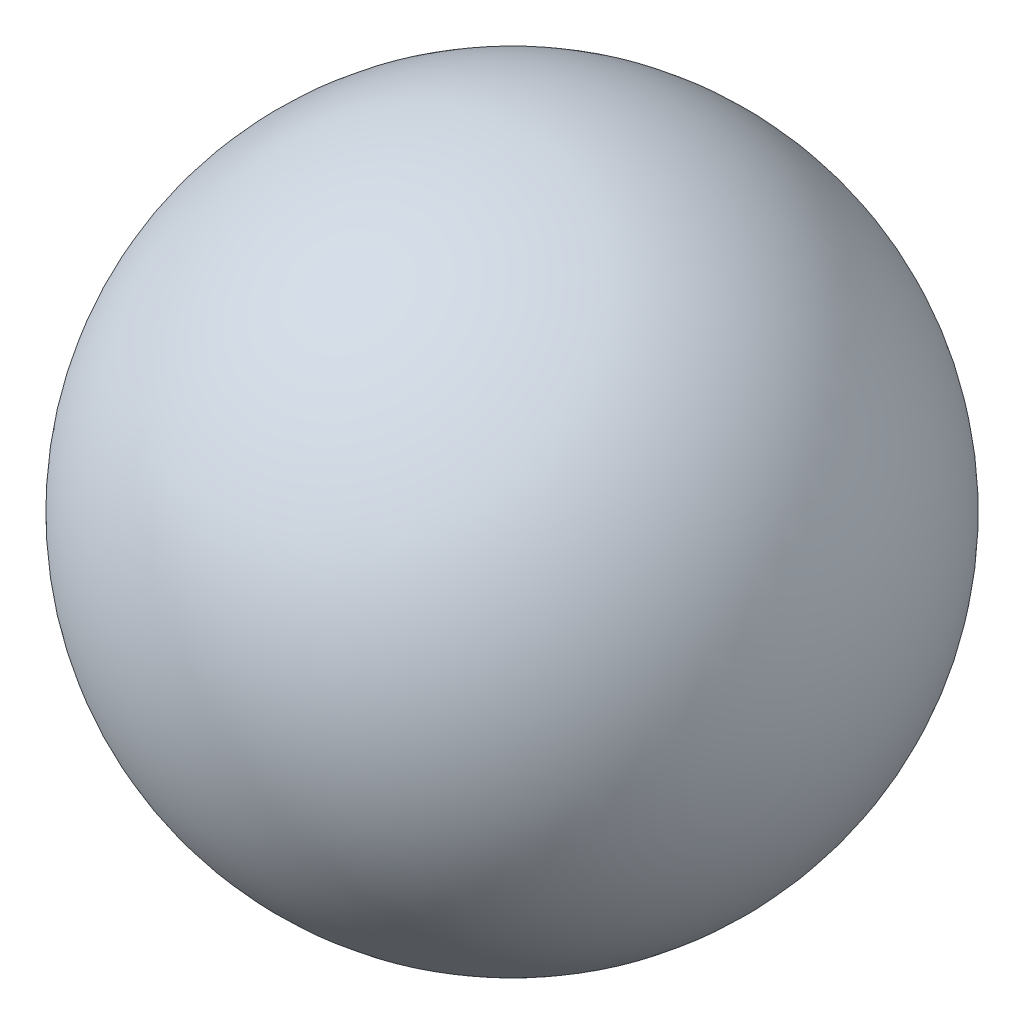
ISO-10303-21;
HEADER;
FILE_DESCRIPTION(('STEP AP214'),'2;1');
FILE_NAME('part.step','',(''),(''),'','','');
FILE_SCHEMA(('AUTOMOTIVE_DESIGN { 1 0 10303 214 1 1 1 1 }'));
ENDSEC;
DATA;
#1=APPLICATION_CONTEXT('core data for automotive mechanical design processes');
#2=APPLICATION_PROTOCOL_DEFINITION('international standard','automotive_design',2000,#1);
#3=PRODUCT_CONTEXT('',#1,'mechanical');
#4=PRODUCT('Part','Part','',(#3));
#5=PRODUCT_RELATED_PRODUCT_CATEGORY('part','',(#4));
#6=PRODUCT_DEFINITION_FORMATION('','',#4);
#7=PRODUCT_DEFINITION_CONTEXT('part definition',#1,'design');
#8=PRODUCT_DEFINITION('design','',#6,#7);
#9=PRODUCT_DEFINITION_SHAPE('','',#8);
#10=(LENGTH_UNIT() NAMED_UNIT(*) SI_UNIT(.MILLI.,.METRE.));
#11=(NAMED_UNIT(*) PLANE_ANGLE_UNIT() SI_UNIT($,.RADIAN.));
#12=(NAMED_UNIT(*) SI_UNIT($,.STERADIAN.) SOLID_ANGLE_UNIT());
#13=UNCERTAINTY_MEASURE_WITH_UNIT(LENGTH_MEASURE(1.E-05),#10,'distance_accuracy_value','');
#14=(GEOMETRIC_REPRESENTATION_CONTEXT(3) GLOBAL_UNCERTAINTY_ASSIGNED_CONTEXT((#13)) GLOBAL_UNIT_ASSIGNED_CONTEXT((#10,
#11,#12)) REPRESENTATION_CONTEXT('',''));
#15=CARTESIAN_POINT('',(0.,0.,0.));
#16=DIRECTION('',(0.,0.,1.));
#17=DIRECTION('',(1.,0.,0.));
#18=AXIS2_PLACEMENT_3D('',#15,#16,#17);
#19=CARTESIAN_POINT('',(0.,0.,0.));
#20=DIRECTION('',(0.,1.,0.));
#21=DIRECTION('',(1.,0.,0.));
#22=AXIS2_PLACEMENT_3D('',#19,#20,#21);
#23=SPHERICAL_SURFACE('',#22,105.);
#24=CARTESIAN_POINT('',(0.,105.,0.));
#25=VERTEX_POINT('',#24);
#26=VERTEX_LOOP('',#25);
#27=FACE_BOUND('',#26,.T.);
#28=ADVANCED_FACE('F28',(#27),#23,.T.);
#29=CLOSED_SHELL('',(#28));
#30=MANIFOLD_SOLID_BREP('B2',#29);
#31=ADVANCED_BREP_SHAPE_REPRESENTATION('',(#18,#30),#14);
#32=SHAPE_DEFINITION_REPRESENTATION(#9,#31);
ENDSEC;
END-ISO-10303-21;
